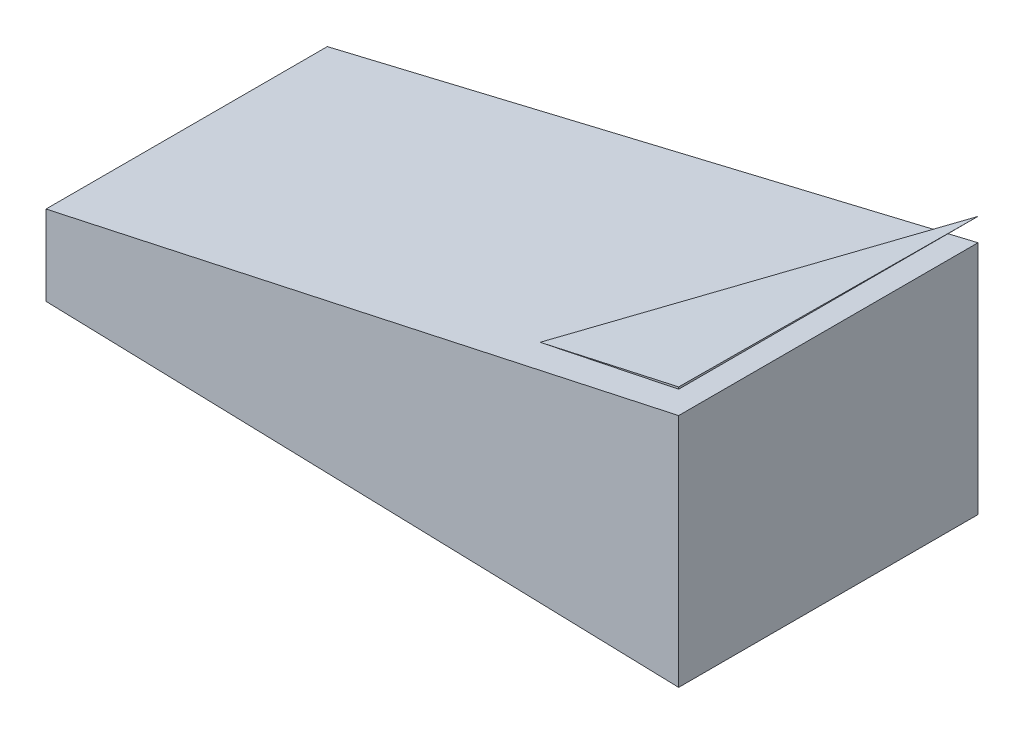
ISO-10303-21;
HEADER;
FILE_DESCRIPTION(('STEP AP214'),'2;1');
FILE_NAME('part.step','',(''),(''),'','','');
FILE_SCHEMA(('AUTOMOTIVE_DESIGN { 1 0 10303 214 1 1 1 1 }'));
ENDSEC;
DATA;
#1=APPLICATION_CONTEXT('core data for automotive mechanical design processes');
#2=APPLICATION_PROTOCOL_DEFINITION('international standard','automotive_design',2000,#1);
#3=PRODUCT_CONTEXT('',#1,'mechanical');
#4=PRODUCT('Part','Part','',(#3));
#5=PRODUCT_RELATED_PRODUCT_CATEGORY('part','',(#4));
#6=PRODUCT_DEFINITION_FORMATION('','',#4);
#7=PRODUCT_DEFINITION_CONTEXT('part definition',#1,'design');
#8=PRODUCT_DEFINITION('design','',#6,#7);
#9=PRODUCT_DEFINITION_SHAPE('','',#8);
#10=(LENGTH_UNIT() NAMED_UNIT(*) SI_UNIT(.MILLI.,.METRE.));
#11=(NAMED_UNIT(*) PLANE_ANGLE_UNIT() SI_UNIT($,.RADIAN.));
#12=(NAMED_UNIT(*) SI_UNIT($,.STERADIAN.) SOLID_ANGLE_UNIT());
#13=UNCERTAINTY_MEASURE_WITH_UNIT(LENGTH_MEASURE(1.E-05),#10,'distance_accuracy_value','');
#14=(GEOMETRIC_REPRESENTATION_CONTEXT(3) GLOBAL_UNCERTAINTY_ASSIGNED_CONTEXT((#13)) GLOBAL_UNIT_ASSIGNED_CONTEXT((#10,
#11,#12)) REPRESENTATION_CONTEXT('',''));
#15=CARTESIAN_POINT('',(0.,0.,0.));
#16=DIRECTION('',(0.,0.,1.));
#17=DIRECTION('',(1.,0.,0.));
#18=AXIS2_PLACEMENT_3D('',#15,#16,#17);
#19=CARTESIAN_POINT('',(76.2,30.48,0.));
#20=DIRECTION('',(-1.,0.,0.));
#21=DIRECTION('',(0.,0.,1.));
#22=AXIS2_PLACEMENT_3D('',#19,#20,#21);
#23=PLANE('',#22);
#24=DIRECTION('',(0.,-1.,0.));
#25=VECTOR('',#24,1.);
#26=CARTESIAN_POINT('',(76.2,30.48,-50.8));
#27=LINE('',#26,#25);
#28=CARTESIAN_POINT('',(76.2000000000005,27.5723211304223,-50.8));
#29=VERTEX_POINT('',#28);
#30=CARTESIAN_POINT('',(76.2,0.,-50.8));
#31=VERTEX_POINT('',#30);
#32=EDGE_CURVE('E98',#29,#31,#27,.T.);
#33=ORIENTED_EDGE('',*,*,#32,.F.);
#34=DIRECTION('',(0.,0.,-1.));
#35=VECTOR('',#34,1.);
#36=CARTESIAN_POINT('',(76.2000000000005,27.5723211304223,-15.7424483633759));
#37=LINE('',#36,#35);
#38=CARTESIAN_POINT('',(76.2000000000005,27.5723211304223,-15.7424483633759));
#39=VERTEX_POINT('',#38);
#40=EDGE_CURVE('E58',#39,#29,#37,.T.);
#41=ORIENTED_EDGE('',*,*,#40,.F.);
#42=DIRECTION('',(0.,1.,0.));
#43=VECTOR('',#42,1.);
#44=CARTESIAN_POINT('',(76.2,0.,-15.7424483633759));
#45=LINE('',#44,#43);
#46=CARTESIAN_POINT('',(76.2,0.,-15.7424483633759));
#47=VERTEX_POINT('',#46);
#48=EDGE_CURVE('E52',#47,#39,#45,.T.);
#49=ORIENTED_EDGE('',*,*,#48,.F.);
#50=DIRECTION('',(0.,0.,-1.));
#51=VECTOR('',#50,1.);
#52=CARTESIAN_POINT('',(76.2,0.,0.));
#53=LINE('',#52,#51);
#54=EDGE_CURVE('E102',#47,#31,#53,.T.);
#55=ORIENTED_EDGE('',*,*,#54,.T.);
#56=EDGE_LOOP('',(#33,#41,#49,#55));
#57=FACE_BOUND('',#56,.T.);
#58=ADVANCED_FACE('F49',(#57),#23,.F.);
#59=CARTESIAN_POINT('',(0.,0.,-17.8514161714666));
#60=DIRECTION('',(0.0276661487527436,0.,-0.999617218845889));
#61=DIRECTION('',(-0.99961721884589,0.,-0.0276661487527436));
#62=AXIS2_PLACEMENT_3D('',#59,#60,#61);
#63=PLANE('',#62);
#64=ORIENTED_EDGE('',*,*,#48,.T.);
#65=DIRECTION('',(-0.97227424024063,-0.232290091929069,-0.0269093841640847));
#66=VECTOR('',#65,1.);
#67=CARTESIAN_POINT('',(-2.11554776658842,8.86162713355779,-17.9099676430704));
#68=LINE('',#67,#66);
#69=CARTESIAN_POINT('',(0.,9.36706146971745,-17.8514161714666));
#70=VERTEX_POINT('',#69);
#71=EDGE_CURVE('E65',#39,#70,#68,.T.);
#72=ORIENTED_EDGE('',*,*,#71,.T.);
#73=DIRECTION('',(0.,1.,0.));
#74=VECTOR('',#73,1.);
#75=CARTESIAN_POINT('',(0.,0.,-17.8514161714666));
#76=LINE('',#75,#74);
#77=CARTESIAN_POINT('',(0.,0.,-17.8514161714666));
#78=VERTEX_POINT('',#77);
#79=EDGE_CURVE('E119',#78,#70,#76,.T.);
#80=ORIENTED_EDGE('',*,*,#79,.F.);
#81=DIRECTION('',(-0.99961721884589,0.,-0.0276661487527436));
#82=VECTOR('',#81,1.);
#83=CARTESIAN_POINT('',(0.,0.,-17.8514161714666));
#84=LINE('',#83,#82);
#85=EDGE_CURVE('E92',#47,#78,#84,.T.);
#86=ORIENTED_EDGE('',*,*,#85,.F.);
#87=EDGE_LOOP('',(#64,#72,#80,#86));
#88=FACE_BOUND('',#87,.T.);
#89=ADVANCED_FACE('F131',(#88),#63,.F.);
#90=CARTESIAN_POINT('',(0.,30.48,0.));
#91=DIRECTION('',(1.,0.,0.));
#92=DIRECTION('',(0.,0.,-1.));
#93=AXIS2_PLACEMENT_3D('',#90,#91,#92);
#94=PLANE('',#93);
#95=ORIENTED_EDGE('',*,*,#79,.T.);
#96=DIRECTION('',(0.,0.,-1.));
#97=VECTOR('',#96,1.);
#98=CARTESIAN_POINT('',(0.,9.36706146971745,-15.7424483633759));
#99=LINE('',#98,#97);
#100=CARTESIAN_POINT('',(0.,9.36706146971745,-50.8));
#101=VERTEX_POINT('',#100);
#102=EDGE_CURVE('E70',#70,#101,#99,.T.);
#103=ORIENTED_EDGE('',*,*,#102,.T.);
#104=DIRECTION('',(0.,-1.,0.));
#105=VECTOR('',#104,1.);
#106=CARTESIAN_POINT('',(0.,30.48,-50.8));
#107=LINE('',#106,#105);
#108=CARTESIAN_POINT('',(0.,0.,-50.8));
#109=VERTEX_POINT('',#108);
#110=EDGE_CURVE('E100',#101,#109,#107,.T.);
#111=ORIENTED_EDGE('',*,*,#110,.T.);
#112=DIRECTION('',(0.,0.,1.));
#113=VECTOR('',#112,1.);
#114=CARTESIAN_POINT('',(0.,0.,0.));
#115=LINE('',#114,#113);
#116=EDGE_CURVE('E106',#109,#78,#115,.T.);
#117=ORIENTED_EDGE('',*,*,#116,.T.);
#118=EDGE_LOOP('',(#95,#103,#111,#117));
#119=FACE_BOUND('',#118,.T.);
#120=ADVANCED_FACE('F128',(#119),#94,.F.);
#121=CARTESIAN_POINT('',(0.,30.48,-50.8));
#122=DIRECTION('',(0.,0.,1.));
#123=DIRECTION('',(1.,0.,0.));
#124=AXIS2_PLACEMENT_3D('',#121,#122,#123);
#125=PLANE('',#124);
#126=ORIENTED_EDGE('',*,*,#110,.F.);
#127=DIRECTION('',(-0.972626450692208,-0.232374239996342,0.));
#128=VECTOR('',#127,1.);
#129=CARTESIAN_POINT('',(0.,9.36706146971745,-50.8));
#130=LINE('',#129,#128);
#131=EDGE_CURVE('E12',#29,#101,#130,.T.);
#132=ORIENTED_EDGE('',*,*,#131,.F.);
#133=ORIENTED_EDGE('',*,*,#32,.T.);
#134=DIRECTION('',(-1.,0.,0.));
#135=VECTOR('',#134,1.);
#136=CARTESIAN_POINT('',(0.,0.,-50.8));
#137=LINE('',#136,#135);
#138=EDGE_CURVE('E105',#31,#109,#137,.T.);
#139=ORIENTED_EDGE('',*,*,#138,.T.);
#140=EDGE_LOOP('',(#126,#132,#133,#139));
#141=FACE_BOUND('',#140,.T.);
#142=ADVANCED_FACE('F96',(#141),#125,.F.);
#143=CARTESIAN_POINT('',(0.,0.,0.));
#144=DIRECTION('',(0.,-1.,0.));
#145=DIRECTION('',(0.,0.,-1.));
#146=AXIS2_PLACEMENT_3D('',#143,#144,#145);
#147=PLANE('',#146);
#148=ORIENTED_EDGE('',*,*,#85,.T.);
#149=ORIENTED_EDGE('',*,*,#116,.F.);
#150=ORIENTED_EDGE('',*,*,#138,.F.);
#151=ORIENTED_EDGE('',*,*,#54,.F.);
#152=EDGE_LOOP('',(#148,#149,#150,#151));
#153=FACE_BOUND('',#152,.T.);
#154=ADVANCED_FACE('F133',(#153),#147,.T.);
#155=CARTESIAN_POINT('',(0.,9.36706146971745,-15.7424483633759));
#156=DIRECTION('',(0.232374239996342,-0.972626450692208,0.));
#157=DIRECTION('',(0.972626450692208,0.232374239996342,0.));
#158=AXIS2_PLACEMENT_3D('',#155,#156,#157);
#159=PLANE('',#158);
#160=ORIENTED_EDGE('',*,*,#40,.T.);
#161=ORIENTED_EDGE('',*,*,#131,.T.);
#162=ORIENTED_EDGE('',*,*,#102,.F.);
#163=ORIENTED_EDGE('',*,*,#71,.F.);
#164=EDGE_LOOP('',(#160,#161,#162,#163));
#165=FACE_BOUND('',#164,.T.);
#166=ADVANCED_FACE('F86',(#165),#159,.F.);
#167=CLOSED_SHELL('',(#58,#89,#120,#142,#154,#166));
#168=MANIFOLD_SOLID_BREP('B2',#167);
#169=CARTESIAN_POINT('',(77.1695361761971,30.48,-50.7731663965305));
#170=DIRECTION('',(0.235608005800904,-0.971826294128073,0.00652086219898339));
#171=DIRECTION('',(0.971846956612793,0.235613015180511,0.));
#172=AXIS2_PLACEMENT_3D('',#169,#170,#171);
#173=PLANE('',#172);
#174=DIRECTION('',(0.,0.00670975404711318,0.999977489346949));
#175=VECTOR('',#174,1.);
#176=CARTESIAN_POINT('',(76.2,30.5856255788633,-0.000708737609403473));
#177=LINE('',#176,#175);
#178=CARTESIAN_POINT('',(76.2000000000005,30.2447671557795,-50.8));
#179=VERTEX_POINT('',#178);
#180=CARTESIAN_POINT('',(76.2,30.48,-15.742448363376));
#181=VERTEX_POINT('',#180);
#182=EDGE_CURVE('E217',#179,#181,#177,.T.);
#183=ORIENTED_EDGE('',*,*,#182,.F.);
#184=DIRECTION('',(-0.43220869200524,-0.09876956926445,0.896348268667059));
#185=VECTOR('',#184,1.);
#186=CARTESIAN_POINT('',(76.3807598557827,30.2860749161882,-51.1748739596679));
#187=LINE('',#186,#185);
#188=CARTESIAN_POINT('',(59.5182813063552,26.432612980171,-16.2041440025954));
#189=VERTEX_POINT('',#188);
#190=EDGE_CURVE('E47',#179,#189,#187,.T.);
#191=ORIENTED_EDGE('',*,*,#190,.T.);
#192=DIRECTION('',(0.971454297337612,0.235698226640119,0.0268866908151748));
#193=VECTOR('',#192,1.);
#194=CARTESIAN_POINT('',(76.2,30.48,-15.742448363376));
#195=LINE('',#194,#193);
#196=EDGE_CURVE('E219',#189,#181,#195,.T.);
#197=ORIENTED_EDGE('',*,*,#196,.T.);
#198=EDGE_LOOP('',(#183,#191,#197));
#199=FACE_BOUND('',#198,.T.);
#200=ADVANCED_FACE('F185',(#199),#173,.F.);
#201=CARTESIAN_POINT('',(0.,0.,-17.8514161714666));
#202=DIRECTION('',(0.0276661487527436,0.,-0.999617218845889));
#203=DIRECTION('',(-0.99961721884589,0.,-0.0276661487527436));
#204=AXIS2_PLACEMENT_3D('',#201,#202,#203);
#205=PLANE('',#204);
#206=ORIENTED_EDGE('',*,*,#196,.F.);
#207=DIRECTION('',(0.974514138001674,0.222698764353807,0.0269713772385133));
#208=VECTOR('',#207,1.);
#209=CARTESIAN_POINT('',(-2.78469379597096,12.1949585123707,-17.9284874256804));
#210=LINE('',#209,#208);
#211=CARTESIAN_POINT('',(76.2000000000005,30.2447671557795,-15.7424483633759));
#212=VERTEX_POINT('',#211);
#213=EDGE_CURVE('E200',#189,#212,#210,.T.);
#214=ORIENTED_EDGE('',*,*,#213,.T.);
#215=DIRECTION('',(0.,1.,0.));
#216=VECTOR('',#215,1.);
#217=CARTESIAN_POINT('',(76.2,0.,-15.7424483633759));
#218=LINE('',#217,#216);
#219=EDGE_CURVE('E193',#212,#181,#218,.T.);
#220=ORIENTED_EDGE('',*,*,#219,.T.);
#221=EDGE_LOOP('',(#206,#214,#220));
#222=FACE_BOUND('',#221,.T.);
#223=ADVANCED_FACE('F223',(#222),#205,.F.);
#224=CARTESIAN_POINT('',(76.2,30.48,0.));
#225=DIRECTION('',(-1.,0.,0.));
#226=DIRECTION('',(0.,0.,1.));
#227=AXIS2_PLACEMENT_3D('',#224,#225,#226);
#228=PLANE('',#227);
#229=ORIENTED_EDGE('',*,*,#219,.F.);
#230=DIRECTION('',(0.,0.,-1.));
#231=VECTOR('',#230,1.);
#232=CARTESIAN_POINT('',(76.2000000000005,30.2447671557795,-15.7424483633759));
#233=LINE('',#232,#231);
#234=EDGE_CURVE('E212',#212,#179,#233,.T.);
#235=ORIENTED_EDGE('',*,*,#234,.T.);
#236=ORIENTED_EDGE('',*,*,#182,.T.);
#237=EDGE_LOOP('',(#229,#235,#236));
#238=FACE_BOUND('',#237,.T.);
#239=ADVANCED_FACE('F187',(#238),#228,.F.);
#240=CARTESIAN_POINT('',(76.2000000000005,30.2447671557795,-15.7424483633759));
#241=DIRECTION('',(-0.222779810260421,0.974868789191823,0.));
#242=DIRECTION('',(-0.974868789191823,-0.222779810260421,0.));
#243=AXIS2_PLACEMENT_3D('',#240,#241,#242);
#244=PLANE('',#243);
#245=ORIENTED_EDGE('',*,*,#190,.F.);
#246=ORIENTED_EDGE('',*,*,#234,.F.);
#247=ORIENTED_EDGE('',*,*,#213,.F.);
#248=EDGE_LOOP('',(#245,#246,#247));
#249=FACE_BOUND('',#248,.T.);
#250=ADVANCED_FACE('F211',(#249),#244,.F.);
#251=CLOSED_SHELL('',(#200,#223,#239,#250));
#252=MANIFOLD_SOLID_BREP('B6',#251);
#253=ADVANCED_BREP_SHAPE_REPRESENTATION('',(#18,#168,#252),#14);
#254=SHAPE_DEFINITION_REPRESENTATION(#9,#253);
ENDSEC;
END-ISO-10303-21;
